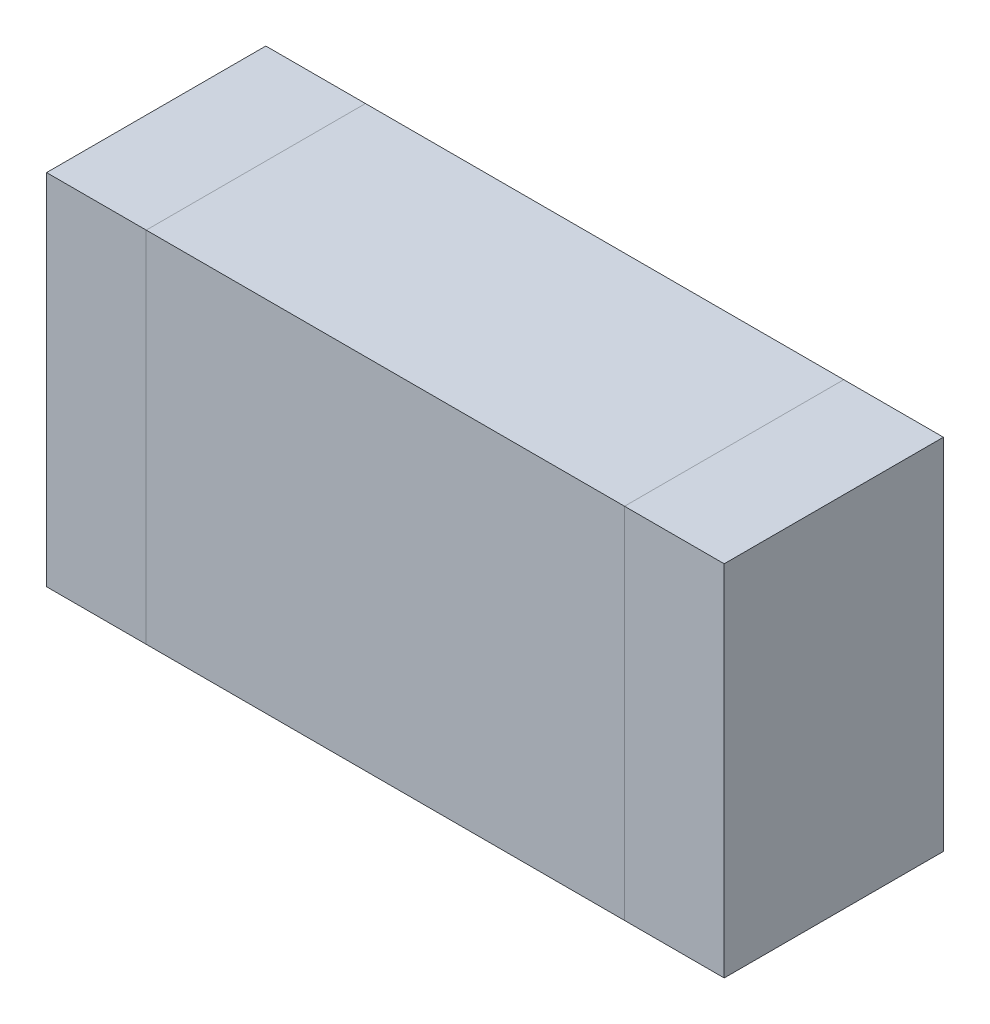
ISO-10303-21;
HEADER;
FILE_DESCRIPTION(('STEP AP214'),'2;1');
FILE_NAME('part.step','',(''),(''),'','','');
FILE_SCHEMA(('AUTOMOTIVE_DESIGN { 1 0 10303 214 1 1 1 1 }'));
ENDSEC;
DATA;
#1=APPLICATION_CONTEXT('core data for automotive mechanical design processes');
#2=APPLICATION_PROTOCOL_DEFINITION('international standard','automotive_design',2000,#1);
#3=PRODUCT_CONTEXT('',#1,'mechanical');
#4=PRODUCT('Part','Part','',(#3));
#5=PRODUCT_RELATED_PRODUCT_CATEGORY('part','',(#4));
#6=PRODUCT_DEFINITION_FORMATION('','',#4);
#7=PRODUCT_DEFINITION_CONTEXT('part definition',#1,'design');
#8=PRODUCT_DEFINITION('design','',#6,#7);
#9=PRODUCT_DEFINITION_SHAPE('','',#8);
#10=(LENGTH_UNIT() NAMED_UNIT(*) SI_UNIT(.MILLI.,.METRE.));
#11=(NAMED_UNIT(*) PLANE_ANGLE_UNIT() SI_UNIT($,.RADIAN.));
#12=(NAMED_UNIT(*) SI_UNIT($,.STERADIAN.) SOLID_ANGLE_UNIT());
#13=UNCERTAINTY_MEASURE_WITH_UNIT(LENGTH_MEASURE(1.E-05),#10,'distance_accuracy_value','');
#14=(GEOMETRIC_REPRESENTATION_CONTEXT(3) GLOBAL_UNCERTAINTY_ASSIGNED_CONTEXT((#13)) GLOBAL_UNIT_ASSIGNED_CONTEXT((#10,
#11,#12)) REPRESENTATION_CONTEXT('',''));
#15=CARTESIAN_POINT('',(0.,0.,0.));
#16=DIRECTION('',(0.,0.,1.));
#17=DIRECTION('',(1.,0.,0.));
#18=AXIS2_PLACEMENT_3D('',#15,#16,#17);
#19=CARTESIAN_POINT('',(0.5999988,-0.4499991,0.));
#20=DIRECTION('',(-1.,0.,0.));
#21=DIRECTION('',(0.,1.,0.));
#22=AXIS2_PLACEMENT_3D('',#19,#20,#21);
#23=PLANE('',#22);
#24=DIRECTION('',(0.,1.,0.));
#25=VECTOR('',#24,1.);
#26=CARTESIAN_POINT('',(0.5999988,-0.4499991,0.));
#27=LINE('',#26,#25);
#28=CARTESIAN_POINT('',(0.5999988,-0.4499991,0.));
#29=VERTEX_POINT('',#28);
#30=CARTESIAN_POINT('',(0.5999988,0.45000164,0.));
#31=VERTEX_POINT('',#30);
#32=EDGE_CURVE('P0_E11',#29,#31,#27,.T.);
#33=ORIENTED_EDGE('',*,*,#32,.T.);
#34=DIRECTION('',(0.,0.,1.));
#35=VECTOR('',#34,1.);
#36=CARTESIAN_POINT('',(0.5999988,0.45000164,0.));
#37=LINE('',#36,#35);
#38=CARTESIAN_POINT('',(0.5999988,0.45000164,0.5499989));
#39=VERTEX_POINT('',#38);
#40=EDGE_CURVE('P0_E24',#31,#39,#37,.T.);
#41=ORIENTED_EDGE('',*,*,#40,.T.);
#42=DIRECTION('',(0.,1.,0.));
#43=VECTOR('',#42,1.);
#44=CARTESIAN_POINT('',(0.5999988,-0.4499991,0.5499989));
#45=LINE('',#44,#43);
#46=CARTESIAN_POINT('',(0.5999988,-0.4499991,0.5499989));
#47=VERTEX_POINT('',#46);
#48=EDGE_CURVE('P0_E87',#47,#39,#45,.T.);
#49=ORIENTED_EDGE('',*,*,#48,.F.);
#50=DIRECTION('',(0.,0.,1.));
#51=VECTOR('',#50,1.);
#52=CARTESIAN_POINT('',(0.5999988,-0.4499991,0.));
#53=LINE('',#52,#51);
#54=EDGE_CURVE('P0_E38',#29,#47,#53,.T.);
#55=ORIENTED_EDGE('',*,*,#54,.F.);
#56=EDGE_LOOP('',(#33,#41,#49,#55));
#57=FACE_BOUND('',#56,.T.);
#58=ADVANCED_FACE('P0_F17',(#57),#23,.F.);
#59=CARTESIAN_POINT('',(0.5999988,0.45000164,0.));
#60=DIRECTION('',(0.,-1.,0.));
#61=DIRECTION('',(-1.,0.,0.));
#62=AXIS2_PLACEMENT_3D('',#59,#60,#61);
#63=PLANE('',#62);
#64=DIRECTION('',(-1.,0.,0.));
#65=VECTOR('',#64,1.);
#66=CARTESIAN_POINT('',(0.5999988,0.45000164,0.));
#67=LINE('',#66,#65);
#68=CARTESIAN_POINT('',(-0.60000134,0.45000164,0.));
#69=VERTEX_POINT('',#68);
#70=EDGE_CURVE('P0_E31',#31,#69,#67,.T.);
#71=ORIENTED_EDGE('',*,*,#70,.T.);
#72=DIRECTION('',(0.,0.,1.));
#73=VECTOR('',#72,1.);
#74=CARTESIAN_POINT('',(-0.60000134,0.45000164,0.));
#75=LINE('',#74,#73);
#76=CARTESIAN_POINT('',(-0.60000134,0.45000164,0.5499989));
#77=VERTEX_POINT('',#76);
#78=EDGE_CURVE('P0_E83',#69,#77,#75,.T.);
#79=ORIENTED_EDGE('',*,*,#78,.T.);
#80=DIRECTION('',(-1.,0.,0.));
#81=VECTOR('',#80,1.);
#82=CARTESIAN_POINT('',(0.5999988,0.45000164,0.5499989));
#83=LINE('',#82,#81);
#84=EDGE_CURVE('P0_E64',#39,#77,#83,.T.);
#85=ORIENTED_EDGE('',*,*,#84,.F.);
#86=ORIENTED_EDGE('',*,*,#40,.F.);
#87=EDGE_LOOP('',(#71,#79,#85,#86));
#88=FACE_BOUND('',#87,.T.);
#89=ADVANCED_FACE('P0_F90',(#88),#63,.F.);
#90=CARTESIAN_POINT('',(-0.60000134,0.45000164,0.));
#91=DIRECTION('',(1.,0.,0.));
#92=DIRECTION('',(0.,-1.,0.));
#93=AXIS2_PLACEMENT_3D('',#90,#91,#92);
#94=PLANE('',#93);
#95=DIRECTION('',(0.,-1.,0.));
#96=VECTOR('',#95,1.);
#97=CARTESIAN_POINT('',(-0.60000134,0.45000164,0.));
#98=LINE('',#97,#96);
#99=CARTESIAN_POINT('',(-0.60000134,-0.4499991,0.));
#100=VERTEX_POINT('',#99);
#101=EDGE_CURVE('P0_E73',#69,#100,#98,.T.);
#102=ORIENTED_EDGE('',*,*,#101,.T.);
#103=DIRECTION('',(0.,0.,1.));
#104=VECTOR('',#103,1.);
#105=CARTESIAN_POINT('',(-0.60000134,-0.4499991,0.));
#106=LINE('',#105,#104);
#107=CARTESIAN_POINT('',(-0.60000134,-0.4499991,0.5499989));
#108=VERTEX_POINT('',#107);
#109=EDGE_CURVE('P0_E68',#100,#108,#106,.T.);
#110=ORIENTED_EDGE('',*,*,#109,.T.);
#111=DIRECTION('',(0.,-1.,0.));
#112=VECTOR('',#111,1.);
#113=CARTESIAN_POINT('',(-0.60000134,0.45000164,0.5499989));
#114=LINE('',#113,#112);
#115=EDGE_CURVE('P0_E58',#77,#108,#114,.T.);
#116=ORIENTED_EDGE('',*,*,#115,.F.);
#117=ORIENTED_EDGE('',*,*,#78,.F.);
#118=EDGE_LOOP('',(#102,#110,#116,#117));
#119=FACE_BOUND('',#118,.T.);
#120=ADVANCED_FACE('P0_F72',(#119),#94,.F.);
#121=CARTESIAN_POINT('',(-0.60000134,-0.4499991,0.));
#122=DIRECTION('',(0.,1.,0.));
#123=DIRECTION('',(1.,0.,0.));
#124=AXIS2_PLACEMENT_3D('',#121,#122,#123);
#125=PLANE('',#124);
#126=DIRECTION('',(1.,0.,0.));
#127=VECTOR('',#126,1.);
#128=CARTESIAN_POINT('',(-0.60000134,-0.4499991,0.));
#129=LINE('',#128,#127);
#130=EDGE_CURVE('P0_E69',#100,#29,#129,.T.);
#131=ORIENTED_EDGE('',*,*,#130,.T.);
#132=ORIENTED_EDGE('',*,*,#54,.T.);
#133=DIRECTION('',(1.,0.,0.));
#134=VECTOR('',#133,1.);
#135=CARTESIAN_POINT('',(-0.60000134,-0.4499991,0.5499989));
#136=LINE('',#135,#134);
#137=EDGE_CURVE('P0_E62',#108,#47,#136,.T.);
#138=ORIENTED_EDGE('',*,*,#137,.F.);
#139=ORIENTED_EDGE('',*,*,#109,.F.);
#140=EDGE_LOOP('',(#131,#132,#138,#139));
#141=FACE_BOUND('',#140,.T.);
#142=ADVANCED_FACE('P0_F77',(#141),#125,.F.);
#143=CARTESIAN_POINT('',(0.5999988,-0.4499991,0.));
#144=DIRECTION('',(0.,0.,-1.));
#145=DIRECTION('',(0.,-1.,0.));
#146=AXIS2_PLACEMENT_3D('',#143,#144,#145);
#147=PLANE('',#146);
#148=ORIENTED_EDGE('',*,*,#130,.F.);
#149=ORIENTED_EDGE('',*,*,#101,.F.);
#150=ORIENTED_EDGE('',*,*,#70,.F.);
#151=ORIENTED_EDGE('',*,*,#32,.F.);
#152=EDGE_LOOP('',(#148,#149,#150,#151));
#153=FACE_BOUND('',#152,.T.);
#154=ADVANCED_FACE('P0_F91',(#153),#147,.T.);
#155=CARTESIAN_POINT('',(0.5999988,-0.4499991,0.5499989));
#156=DIRECTION('',(0.,0.,-1.));
#157=DIRECTION('',(0.,-1.,0.));
#158=AXIS2_PLACEMENT_3D('',#155,#156,#157);
#159=PLANE('',#158);
#160=ORIENTED_EDGE('',*,*,#48,.T.);
#161=ORIENTED_EDGE('',*,*,#84,.T.);
#162=ORIENTED_EDGE('',*,*,#115,.T.);
#163=ORIENTED_EDGE('',*,*,#137,.T.);
#164=EDGE_LOOP('',(#160,#161,#162,#163));
#165=FACE_BOUND('',#164,.T.);
#166=ADVANCED_FACE('P0_F60',(#165),#159,.F.);
#167=CLOSED_SHELL('',(#58,#89,#120,#142,#154,#166));
#168=MANIFOLD_SOLID_BREP('P0_B1',#167);
#169=CARTESIAN_POINT('',(-0.60000134,-0.4499991,0.));
#170=DIRECTION('',(-1.,0.,0.));
#171=DIRECTION('',(0.,1.,0.));
#172=AXIS2_PLACEMENT_3D('',#169,#170,#171);
#173=PLANE('',#172);
#174=DIRECTION('',(0.,1.,0.));
#175=VECTOR('',#174,1.);
#176=CARTESIAN_POINT('',(-0.60000134,-0.4499991,0.));
#177=LINE('',#176,#175);
#178=CARTESIAN_POINT('',(-0.60000134,-0.4499991,0.));
#179=VERTEX_POINT('',#178);
#180=CARTESIAN_POINT('',(-0.60000134,0.45000164,0.));
#181=VERTEX_POINT('',#180);
#182=EDGE_CURVE('P1_E11',#179,#181,#177,.T.);
#183=ORIENTED_EDGE('',*,*,#182,.T.);
#184=DIRECTION('',(0.,0.,1.));
#185=VECTOR('',#184,1.);
#186=CARTESIAN_POINT('',(-0.60000134,0.45000164,0.));
#187=LINE('',#186,#185);
#188=CARTESIAN_POINT('',(-0.60000134,0.45000164,0.5499989));
#189=VERTEX_POINT('',#188);
#190=EDGE_CURVE('P1_E24',#181,#189,#187,.T.);
#191=ORIENTED_EDGE('',*,*,#190,.T.);
#192=DIRECTION('',(0.,1.,0.));
#193=VECTOR('',#192,1.);
#194=CARTESIAN_POINT('',(-0.60000134,-0.4499991,0.5499989));
#195=LINE('',#194,#193);
#196=CARTESIAN_POINT('',(-0.60000134,-0.4499991,0.5499989));
#197=VERTEX_POINT('',#196);
#198=EDGE_CURVE('P1_E87',#197,#189,#195,.T.);
#199=ORIENTED_EDGE('',*,*,#198,.F.);
#200=DIRECTION('',(0.,0.,1.));
#201=VECTOR('',#200,1.);
#202=CARTESIAN_POINT('',(-0.60000134,-0.4499991,0.));
#203=LINE('',#202,#201);
#204=EDGE_CURVE('P1_E36',#179,#197,#203,.T.);
#205=ORIENTED_EDGE('',*,*,#204,.F.);
#206=EDGE_LOOP('',(#183,#191,#199,#205));
#207=FACE_BOUND('',#206,.T.);
#208=ADVANCED_FACE('P1_F17',(#207),#173,.F.);
#209=CARTESIAN_POINT('',(-0.60000134,0.45000164,0.));
#210=DIRECTION('',(0.,-1.,0.));
#211=DIRECTION('',(-1.,0.,0.));
#212=AXIS2_PLACEMENT_3D('',#209,#210,#211);
#213=PLANE('',#212);
#214=DIRECTION('',(-1.,0.,0.));
#215=VECTOR('',#214,1.);
#216=CARTESIAN_POINT('',(-0.60000134,0.45000164,0.));
#217=LINE('',#216,#215);
#218=CARTESIAN_POINT('',(-0.85000084,0.45000164,0.));
#219=VERTEX_POINT('',#218);
#220=EDGE_CURVE('P1_E84',#181,#219,#217,.T.);
#221=ORIENTED_EDGE('',*,*,#220,.T.);
#222=DIRECTION('',(0.,0.,1.));
#223=VECTOR('',#222,1.);
#224=CARTESIAN_POINT('',(-0.85000084,0.45000164,0.));
#225=LINE('',#224,#223);
#226=CARTESIAN_POINT('',(-0.85000084,0.45000164,0.5499989));
#227=VERTEX_POINT('',#226);
#228=EDGE_CURVE('P1_E82',#219,#227,#225,.T.);
#229=ORIENTED_EDGE('',*,*,#228,.T.);
#230=DIRECTION('',(-1.,0.,0.));
#231=VECTOR('',#230,1.);
#232=CARTESIAN_POINT('',(-0.60000134,0.45000164,0.5499989));
#233=LINE('',#232,#231);
#234=EDGE_CURVE('P1_E62',#189,#227,#233,.T.);
#235=ORIENTED_EDGE('',*,*,#234,.F.);
#236=ORIENTED_EDGE('',*,*,#190,.F.);
#237=EDGE_LOOP('',(#221,#229,#235,#236));
#238=FACE_BOUND('',#237,.T.);
#239=ADVANCED_FACE('P1_F89',(#238),#213,.F.);
#240=CARTESIAN_POINT('',(-0.85000084,0.45000164,0.));
#241=DIRECTION('',(1.,0.,0.));
#242=DIRECTION('',(0.,-1.,0.));
#243=AXIS2_PLACEMENT_3D('',#240,#241,#242);
#244=PLANE('',#243);
#245=DIRECTION('',(0.,-1.,0.));
#246=VECTOR('',#245,1.);
#247=CARTESIAN_POINT('',(-0.85000084,0.45000164,0.));
#248=LINE('',#247,#246);
#249=CARTESIAN_POINT('',(-0.85000084,-0.4499991,0.));
#250=VERTEX_POINT('',#249);
#251=EDGE_CURVE('P1_E71',#219,#250,#248,.T.);
#252=ORIENTED_EDGE('',*,*,#251,.T.);
#253=DIRECTION('',(0.,0.,1.));
#254=VECTOR('',#253,1.);
#255=CARTESIAN_POINT('',(-0.85000084,-0.4499991,0.));
#256=LINE('',#255,#254);
#257=CARTESIAN_POINT('',(-0.85000084,-0.4499991,0.5499989));
#258=VERTEX_POINT('',#257);
#259=EDGE_CURVE('P1_E65',#250,#258,#256,.T.);
#260=ORIENTED_EDGE('',*,*,#259,.T.);
#261=DIRECTION('',(0.,-1.,0.));
#262=VECTOR('',#261,1.);
#263=CARTESIAN_POINT('',(-0.85000084,0.45000164,0.5499989));
#264=LINE('',#263,#262);
#265=EDGE_CURVE('P1_E57',#227,#258,#264,.T.);
#266=ORIENTED_EDGE('',*,*,#265,.F.);
#267=ORIENTED_EDGE('',*,*,#228,.F.);
#268=EDGE_LOOP('',(#252,#260,#266,#267));
#269=FACE_BOUND('',#268,.T.);
#270=ADVANCED_FACE('P1_F69',(#269),#244,.F.);
#271=CARTESIAN_POINT('',(-0.85000084,-0.4499991,0.));
#272=DIRECTION('',(0.,1.,0.));
#273=DIRECTION('',(1.,0.,0.));
#274=AXIS2_PLACEMENT_3D('',#271,#272,#273);
#275=PLANE('',#274);
#276=DIRECTION('',(1.,0.,0.));
#277=VECTOR('',#276,1.);
#278=CARTESIAN_POINT('',(-0.85000084,-0.4499991,0.));
#279=LINE('',#278,#277);
#280=EDGE_CURVE('P1_E66',#250,#179,#279,.T.);
#281=ORIENTED_EDGE('',*,*,#280,.T.);
#282=ORIENTED_EDGE('',*,*,#204,.T.);
#283=DIRECTION('',(1.,0.,0.));
#284=VECTOR('',#283,1.);
#285=CARTESIAN_POINT('',(-0.85000084,-0.4499991,0.5499989));
#286=LINE('',#285,#284);
#287=EDGE_CURVE('P1_E61',#258,#197,#286,.T.);
#288=ORIENTED_EDGE('',*,*,#287,.F.);
#289=ORIENTED_EDGE('',*,*,#259,.F.);
#290=EDGE_LOOP('',(#281,#282,#288,#289));
#291=FACE_BOUND('',#290,.T.);
#292=ADVANCED_FACE('P1_F76',(#291),#275,.F.);
#293=CARTESIAN_POINT('',(-0.60000134,-0.4499991,0.));
#294=DIRECTION('',(0.,0.,-1.));
#295=DIRECTION('',(0.,-1.,0.));
#296=AXIS2_PLACEMENT_3D('',#293,#294,#295);
#297=PLANE('',#296);
#298=ORIENTED_EDGE('',*,*,#280,.F.);
#299=ORIENTED_EDGE('',*,*,#251,.F.);
#300=ORIENTED_EDGE('',*,*,#220,.F.);
#301=ORIENTED_EDGE('',*,*,#182,.F.);
#302=EDGE_LOOP('',(#298,#299,#300,#301));
#303=FACE_BOUND('',#302,.T.);
#304=ADVANCED_FACE('P1_F91',(#303),#297,.T.);
#305=CARTESIAN_POINT('',(-0.60000134,-0.4499991,0.5499989));
#306=DIRECTION('',(0.,0.,-1.));
#307=DIRECTION('',(0.,-1.,0.));
#308=AXIS2_PLACEMENT_3D('',#305,#306,#307);
#309=PLANE('',#308);
#310=ORIENTED_EDGE('',*,*,#198,.T.);
#311=ORIENTED_EDGE('',*,*,#234,.T.);
#312=ORIENTED_EDGE('',*,*,#265,.T.);
#313=ORIENTED_EDGE('',*,*,#287,.T.);
#314=EDGE_LOOP('',(#310,#311,#312,#313));
#315=FACE_BOUND('',#314,.T.);
#316=ADVANCED_FACE('P1_F59',(#315),#309,.F.);
#317=CLOSED_SHELL('',(#208,#239,#270,#292,#304,#316));
#318=MANIFOLD_SOLID_BREP('P1_B1',#317);
#319=CARTESIAN_POINT('',(0.84999576,-0.4499991,0.));
#320=DIRECTION('',(-1.,0.,0.));
#321=DIRECTION('',(0.,1.,0.));
#322=AXIS2_PLACEMENT_3D('',#319,#320,#321);
#323=PLANE('',#322);
#324=DIRECTION('',(0.,1.,0.));
#325=VECTOR('',#324,1.);
#326=CARTESIAN_POINT('',(0.84999576,-0.4499991,0.));
#327=LINE('',#326,#325);
#328=CARTESIAN_POINT('',(0.84999576,-0.4499991,0.));
#329=VERTEX_POINT('',#328);
#330=CARTESIAN_POINT('',(0.84999576,0.45000164,0.));
#331=VERTEX_POINT('',#330);
#332=EDGE_CURVE('P2_E10',#329,#331,#327,.T.);
#333=ORIENTED_EDGE('',*,*,#332,.T.);
#334=DIRECTION('',(0.,0.,1.));
#335=VECTOR('',#334,1.);
#336=CARTESIAN_POINT('',(0.84999576,0.45000164,0.));
#337=LINE('',#336,#335);
#338=CARTESIAN_POINT('',(0.84999576,0.45000164,0.5499989));
#339=VERTEX_POINT('',#338);
#340=EDGE_CURVE('P2_E23',#331,#339,#337,.T.);
#341=ORIENTED_EDGE('',*,*,#340,.T.);
#342=DIRECTION('',(0.,1.,0.));
#343=VECTOR('',#342,1.);
#344=CARTESIAN_POINT('',(0.84999576,-0.4499991,0.5499989));
#345=LINE('',#344,#343);
#346=CARTESIAN_POINT('',(0.84999576,-0.4499991,0.5499989));
#347=VERTEX_POINT('',#346);
#348=EDGE_CURVE('P2_E86',#347,#339,#345,.T.);
#349=ORIENTED_EDGE('',*,*,#348,.F.);
#350=DIRECTION('',(0.,0.,1.));
#351=VECTOR('',#350,1.);
#352=CARTESIAN_POINT('',(0.84999576,-0.4499991,0.));
#353=LINE('',#352,#351);
#354=EDGE_CURVE('P2_E35',#329,#347,#353,.T.);
#355=ORIENTED_EDGE('',*,*,#354,.F.);
#356=EDGE_LOOP('',(#333,#341,#349,#355));
#357=FACE_BOUND('',#356,.T.);
#358=ADVANCED_FACE('P2_F16',(#357),#323,.F.);
#359=CARTESIAN_POINT('',(0.84999576,0.45000164,0.));
#360=DIRECTION('',(0.,-1.,0.));
#361=DIRECTION('',(-1.,0.,0.));
#362=AXIS2_PLACEMENT_3D('',#359,#360,#361);
#363=PLANE('',#362);
#364=DIRECTION('',(-1.,0.,0.));
#365=VECTOR('',#364,1.);
#366=CARTESIAN_POINT('',(0.84999576,0.45000164,0.));
#367=LINE('',#366,#365);
#368=CARTESIAN_POINT('',(0.59999626,0.45000164,0.));
#369=VERTEX_POINT('',#368);
#370=EDGE_CURVE('P2_E83',#331,#369,#367,.T.);
#371=ORIENTED_EDGE('',*,*,#370,.T.);
#372=DIRECTION('',(0.,0.,1.));
#373=VECTOR('',#372,1.);
#374=CARTESIAN_POINT('',(0.59999626,0.45000164,0.));
#375=LINE('',#374,#373);
#376=CARTESIAN_POINT('',(0.59999626,0.45000164,0.5499989));
#377=VERTEX_POINT('',#376);
#378=EDGE_CURVE('P2_E81',#369,#377,#375,.T.);
#379=ORIENTED_EDGE('',*,*,#378,.T.);
#380=DIRECTION('',(-1.,0.,0.));
#381=VECTOR('',#380,1.);
#382=CARTESIAN_POINT('',(0.84999576,0.45000164,0.5499989));
#383=LINE('',#382,#381);
#384=EDGE_CURVE('P2_E61',#339,#377,#383,.T.);
#385=ORIENTED_EDGE('',*,*,#384,.F.);
#386=ORIENTED_EDGE('',*,*,#340,.F.);
#387=EDGE_LOOP('',(#371,#379,#385,#386));
#388=FACE_BOUND('',#387,.T.);
#389=ADVANCED_FACE('P2_F88',(#388),#363,.F.);
#390=CARTESIAN_POINT('',(0.59999626,0.45000164,0.));
#391=DIRECTION('',(1.,0.,0.));
#392=DIRECTION('',(0.,-1.,0.));
#393=AXIS2_PLACEMENT_3D('',#390,#391,#392);
#394=PLANE('',#393);
#395=DIRECTION('',(0.,-1.,0.));
#396=VECTOR('',#395,1.);
#397=CARTESIAN_POINT('',(0.59999626,0.45000164,0.));
#398=LINE('',#397,#396);
#399=CARTESIAN_POINT('',(0.59999626,-0.4499991,0.));
#400=VERTEX_POINT('',#399);
#401=EDGE_CURVE('P2_E70',#369,#400,#398,.T.);
#402=ORIENTED_EDGE('',*,*,#401,.T.);
#403=DIRECTION('',(0.,0.,1.));
#404=VECTOR('',#403,1.);
#405=CARTESIAN_POINT('',(0.59999626,-0.4499991,0.));
#406=LINE('',#405,#404);
#407=CARTESIAN_POINT('',(0.59999626,-0.4499991,0.5499989));
#408=VERTEX_POINT('',#407);
#409=EDGE_CURVE('P2_E64',#400,#408,#406,.T.);
#410=ORIENTED_EDGE('',*,*,#409,.T.);
#411=DIRECTION('',(0.,-1.,0.));
#412=VECTOR('',#411,1.);
#413=CARTESIAN_POINT('',(0.59999626,0.45000164,0.5499989));
#414=LINE('',#413,#412);
#415=EDGE_CURVE('P2_E56',#377,#408,#414,.T.);
#416=ORIENTED_EDGE('',*,*,#415,.F.);
#417=ORIENTED_EDGE('',*,*,#378,.F.);
#418=EDGE_LOOP('',(#402,#410,#416,#417));
#419=FACE_BOUND('',#418,.T.);
#420=ADVANCED_FACE('P2_F68',(#419),#394,.F.);
#421=CARTESIAN_POINT('',(0.59999626,-0.4499991,0.));
#422=DIRECTION('',(0.,1.,0.));
#423=DIRECTION('',(1.,0.,0.));
#424=AXIS2_PLACEMENT_3D('',#421,#422,#423);
#425=PLANE('',#424);
#426=DIRECTION('',(1.,0.,0.));
#427=VECTOR('',#426,1.);
#428=CARTESIAN_POINT('',(0.59999626,-0.4499991,0.));
#429=LINE('',#428,#427);
#430=EDGE_CURVE('P2_E65',#400,#329,#429,.T.);
#431=ORIENTED_EDGE('',*,*,#430,.T.);
#432=ORIENTED_EDGE('',*,*,#354,.T.);
#433=DIRECTION('',(1.,0.,0.));
#434=VECTOR('',#433,1.);
#435=CARTESIAN_POINT('',(0.59999626,-0.4499991,0.5499989));
#436=LINE('',#435,#434);
#437=EDGE_CURVE('P2_E60',#408,#347,#436,.T.);
#438=ORIENTED_EDGE('',*,*,#437,.F.);
#439=ORIENTED_EDGE('',*,*,#409,.F.);
#440=EDGE_LOOP('',(#431,#432,#438,#439));
#441=FACE_BOUND('',#440,.T.);
#442=ADVANCED_FACE('P2_F75',(#441),#425,.F.);
#443=CARTESIAN_POINT('',(0.84999576,-0.4499991,0.));
#444=DIRECTION('',(0.,0.,-1.));
#445=DIRECTION('',(0.,-1.,0.));
#446=AXIS2_PLACEMENT_3D('',#443,#444,#445);
#447=PLANE('',#446);
#448=ORIENTED_EDGE('',*,*,#430,.F.);
#449=ORIENTED_EDGE('',*,*,#401,.F.);
#450=ORIENTED_EDGE('',*,*,#370,.F.);
#451=ORIENTED_EDGE('',*,*,#332,.F.);
#452=EDGE_LOOP('',(#448,#449,#450,#451));
#453=FACE_BOUND('',#452,.T.);
#454=ADVANCED_FACE('P2_F90',(#453),#447,.T.);
#455=CARTESIAN_POINT('',(0.84999576,-0.4499991,0.5499989));
#456=DIRECTION('',(0.,0.,-1.));
#457=DIRECTION('',(0.,-1.,0.));
#458=AXIS2_PLACEMENT_3D('',#455,#456,#457);
#459=PLANE('',#458);
#460=ORIENTED_EDGE('',*,*,#348,.T.);
#461=ORIENTED_EDGE('',*,*,#384,.T.);
#462=ORIENTED_EDGE('',*,*,#415,.T.);
#463=ORIENTED_EDGE('',*,*,#437,.T.);
#464=EDGE_LOOP('',(#460,#461,#462,#463));
#465=FACE_BOUND('',#464,.T.);
#466=ADVANCED_FACE('P2_F58',(#465),#459,.F.);
#467=CLOSED_SHELL('',(#358,#389,#420,#442,#454,#466));
#468=MANIFOLD_SOLID_BREP('P2_B1',#467);
#469=ADVANCED_BREP_SHAPE_REPRESENTATION('',(#18,#168,#318,#468),#14);
#470=SHAPE_DEFINITION_REPRESENTATION(#9,#469);
ENDSEC;
END-ISO-10303-21;
